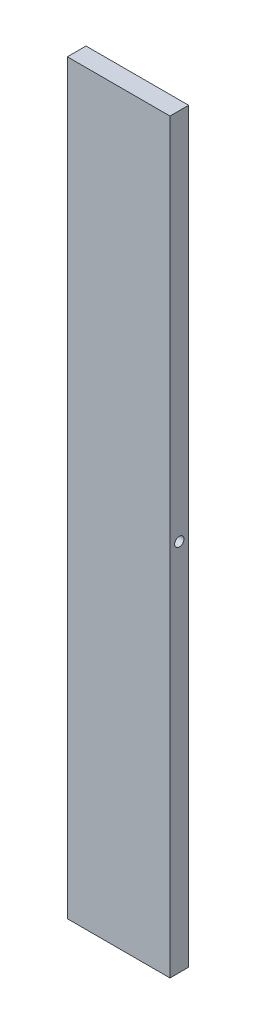
ISO-10303-21;
HEADER;
FILE_DESCRIPTION(('STEP AP214'),'2;1');
FILE_NAME('part.step','',(''),(''),'','','');
FILE_SCHEMA(('AUTOMOTIVE_DESIGN { 1 0 10303 214 1 1 1 1 }'));
ENDSEC;
DATA;
#1=APPLICATION_CONTEXT('core data for automotive mechanical design processes');
#2=APPLICATION_PROTOCOL_DEFINITION('international standard','automotive_design',2000,#1);
#3=PRODUCT_CONTEXT('',#1,'mechanical');
#4=PRODUCT('Part','Part','',(#3));
#5=PRODUCT_RELATED_PRODUCT_CATEGORY('part','',(#4));
#6=PRODUCT_DEFINITION_FORMATION('','',#4);
#7=PRODUCT_DEFINITION_CONTEXT('part definition',#1,'design');
#8=PRODUCT_DEFINITION('design','',#6,#7);
#9=PRODUCT_DEFINITION_SHAPE('','',#8);
#10=(LENGTH_UNIT() NAMED_UNIT(*) SI_UNIT(.MILLI.,.METRE.));
#11=(NAMED_UNIT(*) PLANE_ANGLE_UNIT() SI_UNIT($,.RADIAN.));
#12=(NAMED_UNIT(*) SI_UNIT($,.STERADIAN.) SOLID_ANGLE_UNIT());
#13=UNCERTAINTY_MEASURE_WITH_UNIT(LENGTH_MEASURE(1.E-05),#10,'distance_accuracy_value','');
#14=(GEOMETRIC_REPRESENTATION_CONTEXT(3) GLOBAL_UNCERTAINTY_ASSIGNED_CONTEXT((#13)) GLOBAL_UNIT_ASSIGNED_CONTEXT((#10,
#11,#12)) REPRESENTATION_CONTEXT('',''));
#15=CARTESIAN_POINT('',(0.,0.,0.));
#16=DIRECTION('',(0.,0.,1.));
#17=DIRECTION('',(1.,0.,0.));
#18=AXIS2_PLACEMENT_3D('',#15,#16,#17);
#19=CARTESIAN_POINT('',(55.,0.,0.));
#20=DIRECTION('',(1.,0.,0.));
#21=DIRECTION('',(0.,0.,-1.));
#22=AXIS2_PLACEMENT_3D('',#19,#20,#21);
#23=PLANE('',#22);
#24=DIRECTION('',(0.,1.,0.));
#25=VECTOR('',#24,1.);
#26=CARTESIAN_POINT('',(55.,399.999999999995,-9.99999999999987));
#27=LINE('',#26,#25);
#28=CARTESIAN_POINT('',(55.,-400.000000000005,-10.0000000000001));
#29=VERTEX_POINT('',#28);
#30=CARTESIAN_POINT('',(55.,399.999999999995,-9.99999999999987));
#31=VERTEX_POINT('',#30);
#32=EDGE_CURVE('E89',#29,#31,#27,.T.);
#33=ORIENTED_EDGE('',*,*,#32,.T.);
#34=DIRECTION('',(0.,0.,1.));
#35=VECTOR('',#34,1.);
#36=CARTESIAN_POINT('',(55.,399.999999999995,9.99999999999992));
#37=LINE('',#36,#35);
#38=CARTESIAN_POINT('',(55.,399.999999999995,9.99999999999992));
#39=VERTEX_POINT('',#38);
#40=EDGE_CURVE('E84',#31,#39,#37,.T.);
#41=ORIENTED_EDGE('',*,*,#40,.T.);
#42=DIRECTION('',(0.,-1.,0.));
#43=VECTOR('',#42,1.);
#44=CARTESIAN_POINT('',(55.,399.999999999995,9.99999999999992));
#45=LINE('',#44,#43);
#46=CARTESIAN_POINT('',(55.,-400.000000000005,9.99999999999993));
#47=VERTEX_POINT('',#46);
#48=EDGE_CURVE('E87',#39,#47,#45,.T.);
#49=ORIENTED_EDGE('',*,*,#48,.T.);
#50=DIRECTION('',(0.,0.,-1.));
#51=VECTOR('',#50,1.);
#52=CARTESIAN_POINT('',(55.,-400.000000000005,9.99999999999993));
#53=LINE('',#52,#51);
#54=EDGE_CURVE('E54',#47,#29,#53,.T.);
#55=ORIENTED_EDGE('',*,*,#54,.T.);
#56=EDGE_LOOP('',(#33,#41,#49,#55));
#57=FACE_BOUND('',#56,.T.);
#58=CARTESIAN_POINT('',(55.,-5.16251559892871E-12,0.));
#59=DIRECTION('',(1.,0.,0.));
#60=DIRECTION('',(0.,0.,-1.));
#61=AXIS2_PLACEMENT_3D('',#58,#59,#60);
#62=CIRCLE('',#61,5.00000000000144);
#63=CARTESIAN_POINT('',(55.,-5.16251559892871E-12,-5.00000000000152));
#64=VERTEX_POINT('',#63);
#65=EDGE_CURVE('E104',#64,#64,#62,.T.);
#66=ORIENTED_EDGE('',*,*,#65,.F.);
#67=EDGE_LOOP('',(#66));
#68=FACE_BOUND('',#67,.T.);
#69=ADVANCED_FACE('F37',(#57,#68),#23,.T.);
#70=CARTESIAN_POINT('',(-55.,0.,0.));
#71=DIRECTION('',(1.,0.,0.));
#72=DIRECTION('',(0.,0.,-1.));
#73=AXIS2_PLACEMENT_3D('',#70,#71,#72);
#74=PLANE('',#73);
#75=DIRECTION('',(0.,1.,0.));
#76=VECTOR('',#75,1.);
#77=CARTESIAN_POINT('',(-55.,399.999999999995,-9.99999999999987));
#78=LINE('',#77,#76);
#79=CARTESIAN_POINT('',(-55.,-400.000000000005,-10.0000000000001));
#80=VERTEX_POINT('',#79);
#81=CARTESIAN_POINT('',(-55.,399.999999999995,-9.99999999999987));
#82=VERTEX_POINT('',#81);
#83=EDGE_CURVE('E101',#80,#82,#78,.T.);
#84=ORIENTED_EDGE('',*,*,#83,.F.);
#85=DIRECTION('',(0.,0.,-1.));
#86=VECTOR('',#85,1.);
#87=CARTESIAN_POINT('',(-55.,-400.000000000005,9.99999999999993));
#88=LINE('',#87,#86);
#89=CARTESIAN_POINT('',(-55.,-400.000000000005,9.99999999999993));
#90=VERTEX_POINT('',#89);
#91=EDGE_CURVE('E77',#90,#80,#88,.T.);
#92=ORIENTED_EDGE('',*,*,#91,.F.);
#93=DIRECTION('',(0.,-1.,0.));
#94=VECTOR('',#93,1.);
#95=CARTESIAN_POINT('',(-55.,399.999999999995,9.99999999999992));
#96=LINE('',#95,#94);
#97=CARTESIAN_POINT('',(-55.,399.999999999995,9.99999999999992));
#98=VERTEX_POINT('',#97);
#99=EDGE_CURVE('E71',#98,#90,#96,.T.);
#100=ORIENTED_EDGE('',*,*,#99,.F.);
#101=DIRECTION('',(0.,0.,1.));
#102=VECTOR('',#101,1.);
#103=CARTESIAN_POINT('',(-55.,399.999999999995,9.99999999999992));
#104=LINE('',#103,#102);
#105=EDGE_CURVE('E93',#82,#98,#104,.T.);
#106=ORIENTED_EDGE('',*,*,#105,.F.);
#107=EDGE_LOOP('',(#84,#92,#100,#106));
#108=FACE_BOUND('',#107,.T.);
#109=CARTESIAN_POINT('',(-55.,-5.16251559892871E-12,0.));
#110=DIRECTION('',(1.,0.,0.));
#111=DIRECTION('',(0.,0.,-1.));
#112=AXIS2_PLACEMENT_3D('',#109,#110,#111);
#113=CIRCLE('',#112,5.00000000000144);
#114=CARTESIAN_POINT('',(-55.,-5.16251559892871E-12,-5.00000000000152));
#115=VERTEX_POINT('',#114);
#116=EDGE_CURVE('E116',#115,#115,#113,.T.);
#117=ORIENTED_EDGE('',*,*,#116,.T.);
#118=EDGE_LOOP('',(#117));
#119=FACE_BOUND('',#118,.T.);
#120=ADVANCED_FACE('F112',(#108,#119),#74,.F.);
#121=CARTESIAN_POINT('',(55.,399.999999999995,-9.99999999999987));
#122=DIRECTION('',(0.,0.,1.));
#123=DIRECTION('',(0.,-1.,0.));
#124=AXIS2_PLACEMENT_3D('',#121,#122,#123);
#125=PLANE('',#124);
#126=ORIENTED_EDGE('',*,*,#83,.T.);
#127=DIRECTION('',(-1.,0.,0.));
#128=VECTOR('',#127,1.);
#129=CARTESIAN_POINT('',(55.,399.999999999995,-9.99999999999987));
#130=LINE('',#129,#128);
#131=EDGE_CURVE('E11',#31,#82,#130,.T.);
#132=ORIENTED_EDGE('',*,*,#131,.F.);
#133=ORIENTED_EDGE('',*,*,#32,.F.);
#134=DIRECTION('',(-1.,0.,0.));
#135=VECTOR('',#134,1.);
#136=CARTESIAN_POINT('',(55.,-400.000000000005,-10.0000000000001));
#137=LINE('',#136,#135);
#138=EDGE_CURVE('E97',#29,#80,#137,.T.);
#139=ORIENTED_EDGE('',*,*,#138,.T.);
#140=EDGE_LOOP('',(#126,#132,#133,#139));
#141=FACE_BOUND('',#140,.T.);
#142=ADVANCED_FACE('F39',(#141),#125,.F.);
#143=CARTESIAN_POINT('',(55.,399.999999999995,9.99999999999992));
#144=DIRECTION('',(0.,-1.,0.));
#145=DIRECTION('',(0.,0.,-1.));
#146=AXIS2_PLACEMENT_3D('',#143,#144,#145);
#147=PLANE('',#146);
#148=ORIENTED_EDGE('',*,*,#105,.T.);
#149=DIRECTION('',(-1.,0.,0.));
#150=VECTOR('',#149,1.);
#151=CARTESIAN_POINT('',(55.,399.999999999995,9.99999999999992));
#152=LINE('',#151,#150);
#153=EDGE_CURVE('E46',#39,#98,#152,.T.);
#154=ORIENTED_EDGE('',*,*,#153,.F.);
#155=ORIENTED_EDGE('',*,*,#40,.F.);
#156=ORIENTED_EDGE('',*,*,#131,.T.);
#157=EDGE_LOOP('',(#148,#154,#155,#156));
#158=FACE_BOUND('',#157,.T.);
#159=ADVANCED_FACE('F92',(#158),#147,.F.);
#160=CARTESIAN_POINT('',(55.,399.999999999995,9.99999999999992));
#161=DIRECTION('',(0.,0.,-1.));
#162=DIRECTION('',(0.,1.,0.));
#163=AXIS2_PLACEMENT_3D('',#160,#161,#162);
#164=PLANE('',#163);
#165=ORIENTED_EDGE('',*,*,#99,.T.);
#166=DIRECTION('',(-1.,0.,0.));
#167=VECTOR('',#166,1.);
#168=CARTESIAN_POINT('',(55.,-400.000000000005,9.99999999999993));
#169=LINE('',#168,#167);
#170=EDGE_CURVE('E94',#47,#90,#169,.T.);
#171=ORIENTED_EDGE('',*,*,#170,.F.);
#172=ORIENTED_EDGE('',*,*,#48,.F.);
#173=ORIENTED_EDGE('',*,*,#153,.T.);
#174=EDGE_LOOP('',(#165,#171,#172,#173));
#175=FACE_BOUND('',#174,.T.);
#176=ADVANCED_FACE('F95',(#175),#164,.F.);
#177=CARTESIAN_POINT('',(55.,-400.000000000005,9.99999999999993));
#178=DIRECTION('',(0.,1.,0.));
#179=DIRECTION('',(0.,0.,1.));
#180=AXIS2_PLACEMENT_3D('',#177,#178,#179);
#181=PLANE('',#180);
#182=ORIENTED_EDGE('',*,*,#91,.T.);
#183=ORIENTED_EDGE('',*,*,#138,.F.);
#184=ORIENTED_EDGE('',*,*,#54,.F.);
#185=ORIENTED_EDGE('',*,*,#170,.T.);
#186=EDGE_LOOP('',(#182,#183,#184,#185));
#187=FACE_BOUND('',#186,.T.);
#188=ADVANCED_FACE('F109',(#187),#181,.F.);
#189=CARTESIAN_POINT('',(55.,-5.16251559892871E-12,0.));
#190=DIRECTION('',(-1.,0.,0.));
#191=DIRECTION('',(0.,0.,1.));
#192=AXIS2_PLACEMENT_3D('',#189,#190,#191);
#193=CYLINDRICAL_SURFACE('',#192,5.00000000000144);
#194=ORIENTED_EDGE('',*,*,#65,.T.);
#195=EDGE_LOOP('',(#194));
#196=FACE_BOUND('',#195,.T.);
#197=ORIENTED_EDGE('',*,*,#116,.F.);
#198=EDGE_LOOP('',(#197));
#199=FACE_BOUND('',#198,.T.);
#200=ADVANCED_FACE('F122',(#196,#199),#193,.F.);
#201=CLOSED_SHELL('',(#69,#120,#142,#159,#176,#188,#200));
#202=MANIFOLD_SOLID_BREP('B2',#201);
#203=ADVANCED_BREP_SHAPE_REPRESENTATION('',(#18,#202),#14);
#204=SHAPE_DEFINITION_REPRESENTATION(#9,#203);
ENDSEC;
END-ISO-10303-21;
